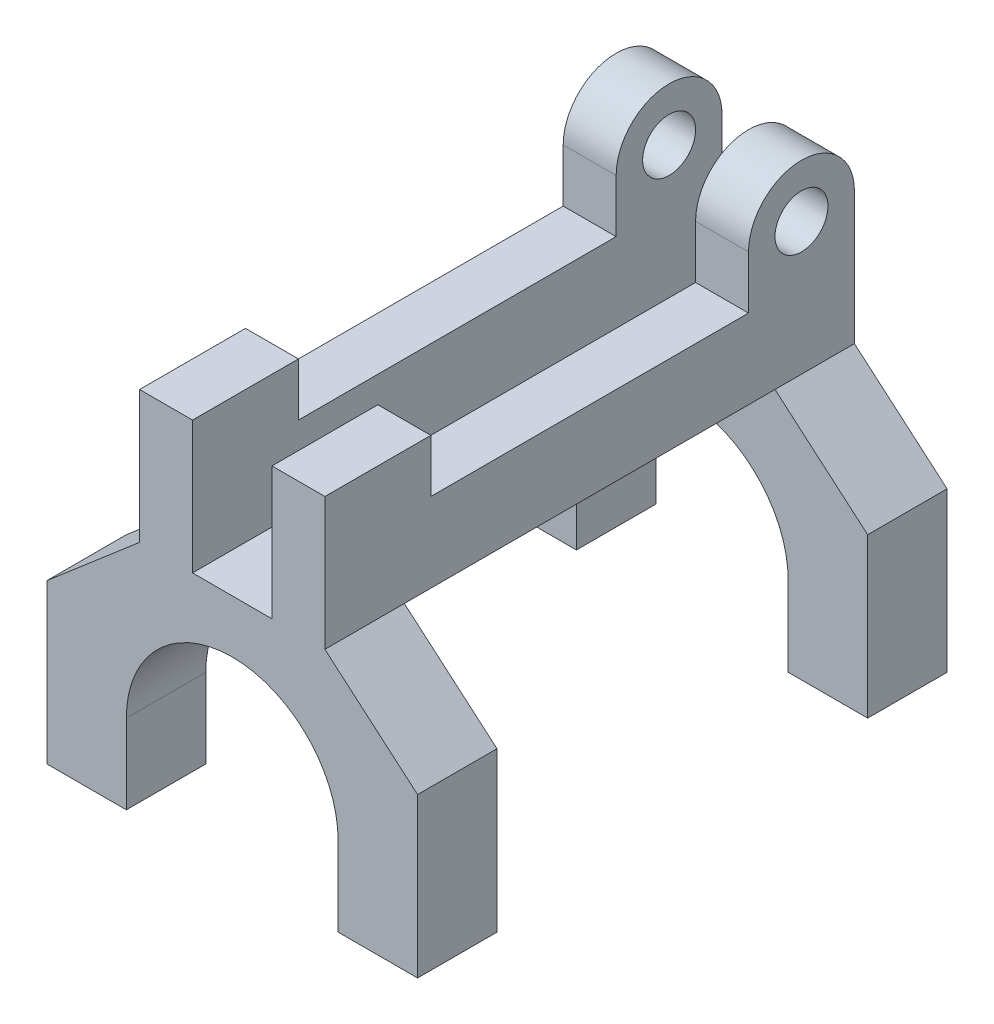
ISO-10303-21;
HEADER;
FILE_DESCRIPTION(('STEP AP214'),'2;1');
FILE_NAME('part.step','',(''),(''),'','','');
FILE_SCHEMA(('AUTOMOTIVE_DESIGN { 1 0 10303 214 1 1 1 1 }'));
ENDSEC;
DATA;
#1=APPLICATION_CONTEXT('core data for automotive mechanical design processes');
#2=APPLICATION_PROTOCOL_DEFINITION('international standard','automotive_design',2000,#1);
#3=PRODUCT_CONTEXT('',#1,'mechanical');
#4=PRODUCT('Part','Part','',(#3));
#5=PRODUCT_RELATED_PRODUCT_CATEGORY('part','',(#4));
#6=PRODUCT_DEFINITION_FORMATION('','',#4);
#7=PRODUCT_DEFINITION_CONTEXT('part definition',#1,'design');
#8=PRODUCT_DEFINITION('design','',#6,#7);
#9=PRODUCT_DEFINITION_SHAPE('','',#8);
#10=(LENGTH_UNIT() NAMED_UNIT(*) SI_UNIT(.MILLI.,.METRE.));
#11=(NAMED_UNIT(*) PLANE_ANGLE_UNIT() SI_UNIT($,.RADIAN.));
#12=(NAMED_UNIT(*) SI_UNIT($,.STERADIAN.) SOLID_ANGLE_UNIT());
#13=UNCERTAINTY_MEASURE_WITH_UNIT(LENGTH_MEASURE(1.E-05),#10,'distance_accuracy_value','');
#14=(GEOMETRIC_REPRESENTATION_CONTEXT(3) GLOBAL_UNCERTAINTY_ASSIGNED_CONTEXT((#13)) GLOBAL_UNIT_ASSIGNED_CONTEXT((#10,
#11,#12)) REPRESENTATION_CONTEXT('',''));
#15=CARTESIAN_POINT('',(0.,0.,0.));
#16=DIRECTION('',(0.,0.,1.));
#17=DIRECTION('',(1.,0.,0.));
#18=AXIS2_PLACEMENT_3D('',#15,#16,#17);
#19=CARTESIAN_POINT('',(0.,0.,127.));
#20=DIRECTION('',(0.,0.,-1.));
#21=DIRECTION('',(-1.,0.,0.));
#22=AXIS2_PLACEMENT_3D('',#19,#20,#21);
#23=CYLINDRICAL_SURFACE('',#22,25.4);
#24=CARTESIAN_POINT('',(0.,0.,19.05));
#25=DIRECTION('',(0.,0.,1.));
#26=DIRECTION('',(1.,0.,0.));
#27=AXIS2_PLACEMENT_3D('',#24,#25,#26);
#28=CIRCLE('',#27,25.4);
#29=CARTESIAN_POINT('',(-25.4,0.,19.05));
#30=VERTEX_POINT('',#29);
#31=CARTESIAN_POINT('',(25.4,0.,19.05));
#32=VERTEX_POINT('',#31);
#33=EDGE_CURVE('E606',#30,#32,#28,.F.);
#34=ORIENTED_EDGE('',*,*,#33,.F.);
#35=DIRECTION('',(0.,0.,-1.));
#36=VECTOR('',#35,1.);
#37=CARTESIAN_POINT('',(-25.4,0.,127.));
#38=LINE('',#37,#36);
#39=CARTESIAN_POINT('',(-25.4,0.,0.));
#40=VERTEX_POINT('',#39);
#41=EDGE_CURVE('E557',#30,#40,#38,.T.);
#42=ORIENTED_EDGE('',*,*,#41,.T.);
#43=CARTESIAN_POINT('',(0.,0.,0.));
#44=DIRECTION('',(0.,0.,-1.));
#45=DIRECTION('',(-1.,0.,0.));
#46=AXIS2_PLACEMENT_3D('',#43,#44,#45);
#47=CIRCLE('',#46,25.4);
#48=CARTESIAN_POINT('',(25.4,0.,0.));
#49=VERTEX_POINT('',#48);
#50=EDGE_CURVE('E505',#40,#49,#47,.T.);
#51=ORIENTED_EDGE('',*,*,#50,.T.);
#52=DIRECTION('',(0.,0.,-1.));
#53=VECTOR('',#52,1.);
#54=CARTESIAN_POINT('',(25.4,0.,127.));
#55=LINE('',#54,#53);
#56=EDGE_CURVE('E338',#32,#49,#55,.T.);
#57=ORIENTED_EDGE('',*,*,#56,.F.);
#58=EDGE_LOOP('',(#34,#42,#51,#57));
#59=FACE_BOUND('',#58,.T.);
#60=ADVANCED_FACE('F39',(#59),#23,.F.);
#61=CARTESIAN_POINT('',(25.4,0.,127.));
#62=DIRECTION('',(1.,0.,0.));
#63=DIRECTION('',(0.,1.,0.));
#64=AXIS2_PLACEMENT_3D('',#61,#62,#63);
#65=PLANE('',#64);
#66=DIRECTION('',(0.,-1.,0.));
#67=VECTOR('',#66,1.);
#68=CARTESIAN_POINT('',(25.4,0.,19.05));
#69=LINE('',#68,#67);
#70=CARTESIAN_POINT('',(25.4,-19.05,19.05));
#71=VERTEX_POINT('',#70);
#72=EDGE_CURVE('E620',#32,#71,#69,.T.);
#73=ORIENTED_EDGE('',*,*,#72,.F.);
#74=ORIENTED_EDGE('',*,*,#56,.T.);
#75=DIRECTION('',(0.,-1.,0.));
#76=VECTOR('',#75,1.);
#77=CARTESIAN_POINT('',(25.4,0.,0.));
#78=LINE('',#77,#76);
#79=CARTESIAN_POINT('',(25.4,-19.05,0.));
#80=VERTEX_POINT('',#79);
#81=EDGE_CURVE('E561',#49,#80,#78,.T.);
#82=ORIENTED_EDGE('',*,*,#81,.T.);
#83=DIRECTION('',(0.,0.,-1.));
#84=VECTOR('',#83,1.);
#85=CARTESIAN_POINT('',(25.4,-19.05,127.));
#86=LINE('',#85,#84);
#87=EDGE_CURVE('E333',#71,#80,#86,.T.);
#88=ORIENTED_EDGE('',*,*,#87,.F.);
#89=EDGE_LOOP('',(#73,#74,#82,#88));
#90=FACE_BOUND('',#89,.T.);
#91=ADVANCED_FACE('F619',(#90),#65,.F.);
#92=CARTESIAN_POINT('',(25.4,-19.05,127.));
#93=DIRECTION('',(0.,1.,0.));
#94=DIRECTION('',(0.,0.,1.));
#95=AXIS2_PLACEMENT_3D('',#92,#93,#94);
#96=PLANE('',#95);
#97=DIRECTION('',(-1.,0.,0.));
#98=VECTOR('',#97,1.);
#99=CARTESIAN_POINT('',(93.2180000000001,-19.05,19.05));
#100=LINE('',#99,#98);
#101=CARTESIAN_POINT('',(44.45,-19.05,19.05));
#102=VERTEX_POINT('',#101);
#103=EDGE_CURVE('E284',#102,#71,#100,.T.);
#104=ORIENTED_EDGE('',*,*,#103,.T.);
#105=ORIENTED_EDGE('',*,*,#87,.T.);
#106=DIRECTION('',(1.,0.,0.));
#107=VECTOR('',#106,1.);
#108=CARTESIAN_POINT('',(25.4,-19.05,0.));
#109=LINE('',#108,#107);
#110=CARTESIAN_POINT('',(44.45,-19.05,0.));
#111=VERTEX_POINT('',#110);
#112=EDGE_CURVE('E565',#80,#111,#109,.T.);
#113=ORIENTED_EDGE('',*,*,#112,.T.);
#114=DIRECTION('',(0.,0.,-1.));
#115=VECTOR('',#114,1.);
#116=CARTESIAN_POINT('',(44.45,-19.05,127.));
#117=LINE('',#116,#115);
#118=EDGE_CURVE('E328',#102,#111,#117,.T.);
#119=ORIENTED_EDGE('',*,*,#118,.F.);
#120=EDGE_LOOP('',(#104,#105,#113,#119));
#121=FACE_BOUND('',#120,.T.);
#122=ADVANCED_FACE('F684',(#121),#96,.F.);
#123=CARTESIAN_POINT('',(44.45,-19.05,127.));
#124=DIRECTION('',(-1.,0.,0.));
#125=DIRECTION('',(0.,0.,1.));
#126=AXIS2_PLACEMENT_3D('',#123,#124,#125);
#127=PLANE('',#126);
#128=DIRECTION('',(0.,1.,0.));
#129=VECTOR('',#128,1.);
#130=CARTESIAN_POINT('',(44.45,-19.05,19.05));
#131=LINE('',#130,#129);
#132=CARTESIAN_POINT('',(44.45,19.05,19.05));
#133=VERTEX_POINT('',#132);
#134=EDGE_CURVE('E768',#102,#133,#131,.T.);
#135=ORIENTED_EDGE('',*,*,#134,.F.);
#136=ORIENTED_EDGE('',*,*,#118,.T.);
#137=DIRECTION('',(0.,1.,0.));
#138=VECTOR('',#137,1.);
#139=CARTESIAN_POINT('',(44.45,-19.05,0.));
#140=LINE('',#139,#138);
#141=CARTESIAN_POINT('',(44.45,19.05,0.));
#142=VERTEX_POINT('',#141);
#143=EDGE_CURVE('E569',#111,#142,#140,.T.);
#144=ORIENTED_EDGE('',*,*,#143,.T.);
#145=DIRECTION('',(0.,0.,-1.));
#146=VECTOR('',#145,1.);
#147=CARTESIAN_POINT('',(44.45,19.05,127.));
#148=LINE('',#147,#146);
#149=EDGE_CURVE('E323',#133,#142,#148,.T.);
#150=ORIENTED_EDGE('',*,*,#149,.F.);
#151=EDGE_LOOP('',(#135,#136,#144,#150));
#152=FACE_BOUND('',#151,.T.);
#153=ADVANCED_FACE('F766',(#152),#127,.F.);
#154=CARTESIAN_POINT('',(44.45,19.05,127.));
#155=DIRECTION('',(-0.650791373455969,-0.759256602365297,0.));
#156=DIRECTION('',(0.759256602365297,-0.650791373455969,0.));
#157=AXIS2_PLACEMENT_3D('',#154,#155,#156);
#158=PLANE('',#157);
#159=DIRECTION('',(-0.759256602365297,0.650791373455969,0.));
#160=VECTOR('',#159,1.);
#161=CARTESIAN_POINT('',(44.45,19.05,19.05));
#162=LINE('',#161,#160);
#163=CARTESIAN_POINT('',(22.225,38.1,19.05));
#164=VERTEX_POINT('',#163);
#165=EDGE_CURVE('E814',#133,#164,#162,.T.);
#166=ORIENTED_EDGE('',*,*,#165,.F.);
#167=ORIENTED_EDGE('',*,*,#149,.T.);
#168=DIRECTION('',(-0.759256602365297,0.650791373455968,0.));
#169=VECTOR('',#168,1.);
#170=CARTESIAN_POINT('',(44.45,19.05,0.));
#171=LINE('',#170,#169);
#172=CARTESIAN_POINT('',(22.225,38.1,0.));
#173=VERTEX_POINT('',#172);
#174=EDGE_CURVE('E573',#142,#173,#171,.T.);
#175=ORIENTED_EDGE('',*,*,#174,.T.);
#176=DIRECTION('',(0.,0.,-1.));
#177=VECTOR('',#176,1.);
#178=CARTESIAN_POINT('',(22.225,38.1,127.));
#179=LINE('',#178,#177);
#180=EDGE_CURVE('E318',#164,#173,#179,.T.);
#181=ORIENTED_EDGE('',*,*,#180,.F.);
#182=EDGE_LOOP('',(#166,#167,#175,#181));
#183=FACE_BOUND('',#182,.T.);
#184=ADVANCED_FACE('F762',(#183),#158,.F.);
#185=CARTESIAN_POINT('',(-44.45,19.05,127.));
#186=DIRECTION('',(0.650791373455969,-0.759256602365297,0.));
#187=DIRECTION('',(0.759256602365297,0.650791373455969,0.));
#188=AXIS2_PLACEMENT_3D('',#185,#186,#187);
#189=PLANE('',#188);
#190=DIRECTION('',(-0.759256602365297,-0.650791373455969,0.));
#191=VECTOR('',#190,1.);
#192=CARTESIAN_POINT('',(-44.45,19.05,19.05));
#193=LINE('',#192,#191);
#194=CARTESIAN_POINT('',(-22.225,38.1,19.05));
#195=VERTEX_POINT('',#194);
#196=CARTESIAN_POINT('',(-44.45,19.05,19.05));
#197=VERTEX_POINT('',#196);
#198=EDGE_CURVE('E634',#195,#197,#193,.T.);
#199=ORIENTED_EDGE('',*,*,#198,.F.);
#200=DIRECTION('',(0.,0.,-1.));
#201=VECTOR('',#200,1.);
#202=CARTESIAN_POINT('',(-22.225,38.1,127.));
#203=LINE('',#202,#201);
#204=CARTESIAN_POINT('',(-22.225,38.1,0.));
#205=VERTEX_POINT('',#204);
#206=EDGE_CURVE('E313',#195,#205,#203,.T.);
#207=ORIENTED_EDGE('',*,*,#206,.T.);
#208=DIRECTION('',(-0.759256602365297,-0.650791373455969,0.));
#209=VECTOR('',#208,1.);
#210=CARTESIAN_POINT('',(-44.45,19.05,0.));
#211=LINE('',#210,#209);
#212=CARTESIAN_POINT('',(-44.45,19.05,0.));
#213=VERTEX_POINT('',#212);
#214=EDGE_CURVE('E577',#205,#213,#211,.T.);
#215=ORIENTED_EDGE('',*,*,#214,.T.);
#216=DIRECTION('',(0.,0.,-1.));
#217=VECTOR('',#216,1.);
#218=CARTESIAN_POINT('',(-44.45,19.05,127.));
#219=LINE('',#218,#217);
#220=EDGE_CURVE('E302',#197,#213,#219,.T.);
#221=ORIENTED_EDGE('',*,*,#220,.F.);
#222=EDGE_LOOP('',(#199,#207,#215,#221));
#223=FACE_BOUND('',#222,.T.);
#224=ADVANCED_FACE('F631',(#223),#189,.F.);
#225=CARTESIAN_POINT('',(-44.45,-19.05,127.));
#226=DIRECTION('',(1.,0.,0.));
#227=DIRECTION('',(0.,1.,0.));
#228=AXIS2_PLACEMENT_3D('',#225,#226,#227);
#229=PLANE('',#228);
#230=DIRECTION('',(0.,1.,0.));
#231=VECTOR('',#230,1.);
#232=CARTESIAN_POINT('',(-44.45,-19.05,19.05));
#233=LINE('',#232,#231);
#234=CARTESIAN_POINT('',(-44.45,-19.05,19.05));
#235=VERTEX_POINT('',#234);
#236=EDGE_CURVE('E297',#235,#197,#233,.T.);
#237=ORIENTED_EDGE('',*,*,#236,.T.);
#238=ORIENTED_EDGE('',*,*,#220,.T.);
#239=DIRECTION('',(0.,-1.,0.));
#240=VECTOR('',#239,1.);
#241=CARTESIAN_POINT('',(-44.45,-19.05,0.));
#242=LINE('',#241,#240);
#243=CARTESIAN_POINT('',(-44.45,-19.05,0.));
#244=VERTEX_POINT('',#243);
#245=EDGE_CURVE('E581',#213,#244,#242,.T.);
#246=ORIENTED_EDGE('',*,*,#245,.T.);
#247=DIRECTION('',(0.,0.,-1.));
#248=VECTOR('',#247,1.);
#249=CARTESIAN_POINT('',(-44.45,-19.05,127.));
#250=LINE('',#249,#248);
#251=EDGE_CURVE('E303',#235,#244,#250,.T.);
#252=ORIENTED_EDGE('',*,*,#251,.F.);
#253=EDGE_LOOP('',(#237,#238,#246,#252));
#254=FACE_BOUND('',#253,.T.);
#255=ADVANCED_FACE('F861',(#254),#229,.F.);
#256=CARTESIAN_POINT('',(-25.4,-19.05,127.));
#257=DIRECTION('',(0.,1.,0.));
#258=DIRECTION('',(-1.,0.,0.));
#259=AXIS2_PLACEMENT_3D('',#256,#257,#258);
#260=PLANE('',#259);
#261=CARTESIAN_POINT('',(-25.4,-19.05,19.05));
#262=VERTEX_POINT('',#261);
#263=EDGE_CURVE('E296',#262,#235,#100,.T.);
#264=ORIENTED_EDGE('',*,*,#263,.T.);
#265=ORIENTED_EDGE('',*,*,#251,.T.);
#266=DIRECTION('',(1.,0.,0.));
#267=VECTOR('',#266,1.);
#268=CARTESIAN_POINT('',(-25.4,-19.05,0.));
#269=LINE('',#268,#267);
#270=CARTESIAN_POINT('',(-25.4,-19.05,0.));
#271=VERTEX_POINT('',#270);
#272=EDGE_CURVE('E585',#244,#271,#269,.T.);
#273=ORIENTED_EDGE('',*,*,#272,.T.);
#274=DIRECTION('',(0.,0.,-1.));
#275=VECTOR('',#274,1.);
#276=CARTESIAN_POINT('',(-25.4,-19.05,127.));
#277=LINE('',#276,#275);
#278=EDGE_CURVE('E594',#262,#271,#277,.T.);
#279=ORIENTED_EDGE('',*,*,#278,.F.);
#280=EDGE_LOOP('',(#264,#265,#273,#279));
#281=FACE_BOUND('',#280,.T.);
#282=ADVANCED_FACE('F853',(#281),#260,.F.);
#283=CARTESIAN_POINT('',(-25.4,0.,127.));
#284=DIRECTION('',(-1.,0.,0.));
#285=DIRECTION('',(0.,-1.,0.));
#286=AXIS2_PLACEMENT_3D('',#283,#284,#285);
#287=PLANE('',#286);
#288=DIRECTION('',(0.,1.,0.));
#289=VECTOR('',#288,1.);
#290=CARTESIAN_POINT('',(-25.4,0.,19.05));
#291=LINE('',#290,#289);
#292=EDGE_CURVE('E805',#262,#30,#291,.T.);
#293=ORIENTED_EDGE('',*,*,#292,.F.);
#294=ORIENTED_EDGE('',*,*,#278,.T.);
#295=DIRECTION('',(0.,1.,0.));
#296=VECTOR('',#295,1.);
#297=CARTESIAN_POINT('',(-25.4,0.,0.));
#298=LINE('',#297,#296);
#299=EDGE_CURVE('E534',#271,#40,#298,.T.);
#300=ORIENTED_EDGE('',*,*,#299,.T.);
#301=ORIENTED_EDGE('',*,*,#41,.F.);
#302=EDGE_LOOP('',(#293,#294,#300,#301));
#303=FACE_BOUND('',#302,.T.);
#304=ADVANCED_FACE('F610',(#303),#287,.F.);
#305=CARTESIAN_POINT('',(-9.525,38.1,-10.668));
#306=DIRECTION('',(0.,-1.,0.));
#307=DIRECTION('',(0.,0.,-1.));
#308=AXIS2_PLACEMENT_3D('',#305,#306,#307);
#309=PLANE('',#308);
#310=DIRECTION('',(-1.,0.,0.));
#311=VECTOR('',#310,1.);
#312=CARTESIAN_POINT('',(-9.525,38.1,19.05));
#313=LINE('',#312,#311);
#314=CARTESIAN_POINT('',(9.52499999999999,38.1,19.05));
#315=VERTEX_POINT('',#314);
#316=CARTESIAN_POINT('',(-9.52499999999999,38.1,19.05));
#317=VERTEX_POINT('',#316);
#318=EDGE_CURVE('E11',#315,#317,#313,.T.);
#319=ORIENTED_EDGE('',*,*,#318,.F.);
#320=DIRECTION('',(0.,0.,1.));
#321=VECTOR('',#320,1.);
#322=CARTESIAN_POINT('',(9.525,38.1,-10.668));
#323=LINE('',#322,#321);
#324=CARTESIAN_POINT('',(9.525,38.1,0.));
#325=VERTEX_POINT('',#324);
#326=EDGE_CURVE('E349',#325,#315,#323,.T.);
#327=ORIENTED_EDGE('',*,*,#326,.F.);
#328=DIRECTION('',(-1.,0.,0.));
#329=VECTOR('',#328,1.);
#330=CARTESIAN_POINT('',(0.,38.1,0.));
#331=LINE('',#330,#329);
#332=CARTESIAN_POINT('',(-9.525,38.1,0.));
#333=VERTEX_POINT('',#332);
#334=EDGE_CURVE('E343',#325,#333,#331,.T.);
#335=ORIENTED_EDGE('',*,*,#334,.T.);
#336=DIRECTION('',(0.,0.,1.));
#337=VECTOR('',#336,1.);
#338=CARTESIAN_POINT('',(-9.525,38.1,-10.668));
#339=LINE('',#338,#337);
#340=EDGE_CURVE('E383',#333,#317,#339,.T.);
#341=ORIENTED_EDGE('',*,*,#340,.T.);
#342=EDGE_LOOP('',(#319,#327,#335,#341));
#343=FACE_BOUND('',#342,.T.);
#344=ADVANCED_FACE('F404',(#343),#309,.F.);
#345=CARTESIAN_POINT('',(-22.225,69.85,127.));
#346=DIRECTION('',(0.,1.,0.));
#347=DIRECTION('',(-1.,0.,0.));
#348=AXIS2_PLACEMENT_3D('',#345,#346,#347);
#349=PLANE('',#348);
#350=DIRECTION('',(0.,0.,-1.));
#351=VECTOR('',#350,1.);
#352=CARTESIAN_POINT('',(9.52500000000001,69.85,127.));
#353=LINE('',#352,#351);
#354=CARTESIAN_POINT('',(9.525,69.85,127.));
#355=VERTEX_POINT('',#354);
#356=CARTESIAN_POINT('',(9.52500000000001,69.85,101.6));
#357=VERTEX_POINT('',#356);
#358=EDGE_CURVE('E432',#355,#357,#353,.T.);
#359=ORIENTED_EDGE('',*,*,#358,.F.);
#360=DIRECTION('',(1.,0.,0.));
#361=VECTOR('',#360,1.);
#362=CARTESIAN_POINT('',(-22.225,69.85,127.));
#363=LINE('',#362,#361);
#364=CARTESIAN_POINT('',(22.225,69.85,127.));
#365=VERTEX_POINT('',#364);
#366=EDGE_CURVE('E506',#355,#365,#363,.T.);
#367=ORIENTED_EDGE('',*,*,#366,.T.);
#368=DIRECTION('',(0.,0.,1.));
#369=VECTOR('',#368,1.);
#370=CARTESIAN_POINT('',(22.225,69.85,127.));
#371=LINE('',#370,#369);
#372=CARTESIAN_POINT('',(22.225,69.85,101.6));
#373=VERTEX_POINT('',#372);
#374=EDGE_CURVE('E494',#373,#365,#371,.T.);
#375=ORIENTED_EDGE('',*,*,#374,.F.);
#376=DIRECTION('',(1.,0.,0.));
#377=VECTOR('',#376,1.);
#378=CARTESIAN_POINT('',(-22.225,69.85,101.6));
#379=LINE('',#378,#377);
#380=EDGE_CURVE('E511',#357,#373,#379,.T.);
#381=ORIENTED_EDGE('',*,*,#380,.F.);
#382=EDGE_LOOP('',(#359,#367,#375,#381));
#383=FACE_BOUND('',#382,.T.);
#384=ADVANCED_FACE('F723',(#383),#349,.T.);
#385=CARTESIAN_POINT('',(-22.225,69.85,101.6));
#386=DIRECTION('',(0.,0.,-1.));
#387=DIRECTION('',(0.,1.,0.));
#388=AXIS2_PLACEMENT_3D('',#385,#386,#387);
#389=PLANE('',#388);
#390=DIRECTION('',(0.,-1.,0.));
#391=VECTOR('',#390,1.);
#392=CARTESIAN_POINT('',(9.52500000000001,69.85,101.6));
#393=LINE('',#392,#391);
#394=CARTESIAN_POINT('',(9.525,57.15,101.6));
#395=VERTEX_POINT('',#394);
#396=EDGE_CURVE('E429',#357,#395,#393,.T.);
#397=ORIENTED_EDGE('',*,*,#396,.F.);
#398=ORIENTED_EDGE('',*,*,#380,.T.);
#399=DIRECTION('',(0.,1.,0.));
#400=VECTOR('',#399,1.);
#401=CARTESIAN_POINT('',(22.225,69.85,101.6));
#402=LINE('',#401,#400);
#403=CARTESIAN_POINT('',(22.225,57.15,101.6));
#404=VERTEX_POINT('',#403);
#405=EDGE_CURVE('E490',#404,#373,#402,.T.);
#406=ORIENTED_EDGE('',*,*,#405,.F.);
#407=DIRECTION('',(1.,0.,0.));
#408=VECTOR('',#407,1.);
#409=CARTESIAN_POINT('',(-22.225,57.15,101.6));
#410=LINE('',#409,#408);
#411=EDGE_CURVE('E516',#395,#404,#410,.T.);
#412=ORIENTED_EDGE('',*,*,#411,.F.);
#413=EDGE_LOOP('',(#397,#398,#406,#412));
#414=FACE_BOUND('',#413,.T.);
#415=ADVANCED_FACE('F725',(#414),#389,.T.);
#416=CARTESIAN_POINT('',(-22.225,57.15,101.6));
#417=DIRECTION('',(0.,1.,0.));
#418=DIRECTION('',(-1.,0.,0.));
#419=AXIS2_PLACEMENT_3D('',#416,#417,#418);
#420=PLANE('',#419);
#421=DIRECTION('',(0.,0.,-1.));
#422=VECTOR('',#421,1.);
#423=CARTESIAN_POINT('',(9.525,57.15,101.6));
#424=LINE('',#423,#422);
#425=CARTESIAN_POINT('',(9.525,57.15,25.4));
#426=VERTEX_POINT('',#425);
#427=EDGE_CURVE('E426',#395,#426,#424,.T.);
#428=ORIENTED_EDGE('',*,*,#427,.F.);
#429=ORIENTED_EDGE('',*,*,#411,.T.);
#430=DIRECTION('',(0.,0.,1.));
#431=VECTOR('',#430,1.);
#432=CARTESIAN_POINT('',(22.225,57.15,101.6));
#433=LINE('',#432,#431);
#434=CARTESIAN_POINT('',(22.225,57.15,25.4));
#435=VERTEX_POINT('',#434);
#436=EDGE_CURVE('E486',#435,#404,#433,.T.);
#437=ORIENTED_EDGE('',*,*,#436,.F.);
#438=DIRECTION('',(1.,0.,0.));
#439=VECTOR('',#438,1.);
#440=CARTESIAN_POINT('',(-22.225,57.15,25.4));
#441=LINE('',#440,#439);
#442=EDGE_CURVE('E521',#426,#435,#441,.T.);
#443=ORIENTED_EDGE('',*,*,#442,.F.);
#444=EDGE_LOOP('',(#428,#429,#437,#443));
#445=FACE_BOUND('',#444,.T.);
#446=ADVANCED_FACE('F677',(#445),#420,.T.);
#447=CARTESIAN_POINT('',(-22.225,57.15,25.4));
#448=DIRECTION('',(0.,0.,1.));
#449=DIRECTION('',(0.,-1.,0.));
#450=AXIS2_PLACEMENT_3D('',#447,#448,#449);
#451=PLANE('',#450);
#452=DIRECTION('',(0.,1.,0.));
#453=VECTOR('',#452,1.);
#454=CARTESIAN_POINT('',(9.525,57.15,25.4));
#455=LINE('',#454,#453);
#456=CARTESIAN_POINT('',(9.52500000000001,69.85,25.4));
#457=VERTEX_POINT('',#456);
#458=EDGE_CURVE('E423',#426,#457,#455,.T.);
#459=ORIENTED_EDGE('',*,*,#458,.F.);
#460=ORIENTED_EDGE('',*,*,#442,.T.);
#461=DIRECTION('',(0.,-1.,0.));
#462=VECTOR('',#461,1.);
#463=CARTESIAN_POINT('',(22.225,57.15,25.4));
#464=LINE('',#463,#462);
#465=CARTESIAN_POINT('',(22.225,69.85,25.4));
#466=VERTEX_POINT('',#465);
#467=EDGE_CURVE('E482',#466,#435,#464,.T.);
#468=ORIENTED_EDGE('',*,*,#467,.F.);
#469=DIRECTION('',(1.,0.,0.));
#470=VECTOR('',#469,1.);
#471=CARTESIAN_POINT('',(-22.225,69.85,25.4));
#472=LINE('',#471,#470);
#473=EDGE_CURVE('E526',#457,#466,#472,.T.);
#474=ORIENTED_EDGE('',*,*,#473,.F.);
#475=EDGE_LOOP('',(#459,#460,#468,#474));
#476=FACE_BOUND('',#475,.T.);
#477=ADVANCED_FACE('F669',(#476),#451,.T.);
#478=CARTESIAN_POINT('',(-22.225,69.85,12.7));
#479=DIRECTION('',(1.,0.,0.));
#480=DIRECTION('',(0.,1.,0.));
#481=AXIS2_PLACEMENT_3D('',#478,#479,#480);
#482=CYLINDRICAL_SURFACE('',#481,12.7);
#483=CARTESIAN_POINT('',(9.52500000000001,69.85,12.7));
#484=DIRECTION('',(1.,0.,0.));
#485=DIRECTION('',(0.,1.,0.));
#486=AXIS2_PLACEMENT_3D('',#483,#484,#485);
#487=CIRCLE('',#486,12.7);
#488=CARTESIAN_POINT('',(9.52500000000001,69.85,0.));
#489=VERTEX_POINT('',#488);
#490=EDGE_CURVE('E354',#457,#489,#487,.F.);
#491=ORIENTED_EDGE('',*,*,#490,.F.);
#492=ORIENTED_EDGE('',*,*,#473,.T.);
#493=CARTESIAN_POINT('',(22.225,69.85,12.7));
#494=DIRECTION('',(1.,0.,0.));
#495=DIRECTION('',(0.,-1.,0.));
#496=AXIS2_PLACEMENT_3D('',#493,#494,#495);
#497=CIRCLE('',#496,12.7);
#498=CARTESIAN_POINT('',(22.225,69.85,0.));
#499=VERTEX_POINT('',#498);
#500=EDGE_CURVE('E478',#499,#466,#497,.T.);
#501=ORIENTED_EDGE('',*,*,#500,.F.);
#502=DIRECTION('',(1.,0.,0.));
#503=VECTOR('',#502,1.);
#504=CARTESIAN_POINT('',(-22.225,69.85,0.));
#505=LINE('',#504,#503);
#506=EDGE_CURVE('E474',#489,#499,#505,.T.);
#507=ORIENTED_EDGE('',*,*,#506,.F.);
#508=EDGE_LOOP('',(#491,#492,#501,#507));
#509=FACE_BOUND('',#508,.T.);
#510=ADVANCED_FACE('F675',(#509),#482,.T.);
#511=CARTESIAN_POINT('',(-22.225,69.85,12.7));
#512=DIRECTION('',(1.,0.,0.));
#513=DIRECTION('',(0.,1.,0.));
#514=AXIS2_PLACEMENT_3D('',#511,#512,#513);
#515=CYLINDRICAL_SURFACE('',#514,6.35);
#516=CARTESIAN_POINT('',(9.52500000000001,69.85,12.7));
#517=DIRECTION('',(1.,0.,0.));
#518=DIRECTION('',(0.,1.,0.));
#519=AXIS2_PLACEMENT_3D('',#516,#517,#518);
#520=CIRCLE('',#519,6.35);
#521=CARTESIAN_POINT('',(9.52500000000001,76.2,12.7));
#522=VERTEX_POINT('',#521);
#523=EDGE_CURVE('E350',#522,#522,#520,.F.);
#524=ORIENTED_EDGE('',*,*,#523,.T.);
#525=EDGE_LOOP('',(#524));
#526=FACE_BOUND('',#525,.T.);
#527=CARTESIAN_POINT('',(22.225,69.85,12.7));
#528=DIRECTION('',(1.,0.,0.));
#529=DIRECTION('',(0.,1.,0.));
#530=AXIS2_PLACEMENT_3D('',#527,#528,#529);
#531=CIRCLE('',#530,6.35);
#532=CARTESIAN_POINT('',(22.225,76.2,12.7));
#533=VERTEX_POINT('',#532);
#534=EDGE_CURVE('E437',#533,#533,#531,.T.);
#535=ORIENTED_EDGE('',*,*,#534,.T.);
#536=EDGE_LOOP('',(#535));
#537=FACE_BOUND('',#536,.T.);
#538=ADVANCED_FACE('F687',(#526,#537),#515,.F.);
#539=CARTESIAN_POINT('',(-25.4,0.,127.));
#540=VERTEX_POINT('',#539);
#541=CARTESIAN_POINT('',(-25.4,0.,107.95));
#542=VERTEX_POINT('',#541);
#543=EDGE_CURVE('E591',#540,#542,#38,.T.);
#544=ORIENTED_EDGE('',*,*,#543,.T.);
#545=CARTESIAN_POINT('',(0.,0.,107.95));
#546=DIRECTION('',(0.,0.,1.));
#547=DIRECTION('',(1.,0.,0.));
#548=AXIS2_PLACEMENT_3D('',#545,#546,#547);
#549=CIRCLE('',#548,25.4);
#550=CARTESIAN_POINT('',(25.4,0.,107.95));
#551=VERTEX_POINT('',#550);
#552=EDGE_CURVE('E787',#542,#551,#549,.F.);
#553=ORIENTED_EDGE('',*,*,#552,.T.);
#554=CARTESIAN_POINT('',(25.4,0.,127.));
#555=VERTEX_POINT('',#554);
#556=EDGE_CURVE('E339',#555,#551,#55,.T.);
#557=ORIENTED_EDGE('',*,*,#556,.F.);
#558=CARTESIAN_POINT('',(0.,0.,127.));
#559=DIRECTION('',(0.,0.,-1.));
#560=DIRECTION('',(-1.,0.,0.));
#561=AXIS2_PLACEMENT_3D('',#558,#559,#560);
#562=CIRCLE('',#561,25.4);
#563=EDGE_CURVE('E529',#540,#555,#562,.T.);
#564=ORIENTED_EDGE('',*,*,#563,.F.);
#565=EDGE_LOOP('',(#544,#553,#557,#564));
#566=FACE_BOUND('',#565,.T.);
#567=ADVANCED_FACE('F41',(#566),#23,.F.);
#568=ORIENTED_EDGE('',*,*,#556,.T.);
#569=DIRECTION('',(0.,-1.,0.));
#570=VECTOR('',#569,1.);
#571=CARTESIAN_POINT('',(25.4,0.,107.95));
#572=LINE('',#571,#570);
#573=CARTESIAN_POINT('',(25.4,-19.05,107.95));
#574=VERTEX_POINT('',#573);
#575=EDGE_CURVE('E790',#551,#574,#572,.T.);
#576=ORIENTED_EDGE('',*,*,#575,.T.);
#577=CARTESIAN_POINT('',(25.4,-19.05,127.));
#578=VERTEX_POINT('',#577);
#579=EDGE_CURVE('E334',#578,#574,#86,.T.);
#580=ORIENTED_EDGE('',*,*,#579,.F.);
#581=DIRECTION('',(0.,-1.,0.));
#582=VECTOR('',#581,1.);
#583=CARTESIAN_POINT('',(25.4,0.,127.));
#584=LINE('',#583,#582);
#585=EDGE_CURVE('E533',#555,#578,#584,.T.);
#586=ORIENTED_EDGE('',*,*,#585,.F.);
#587=EDGE_LOOP('',(#568,#576,#580,#586));
#588=FACE_BOUND('',#587,.T.);
#589=ADVANCED_FACE('F685',(#588),#65,.F.);
#590=ORIENTED_EDGE('',*,*,#579,.T.);
#591=DIRECTION('',(-1.,0.,0.));
#592=VECTOR('',#591,1.);
#593=CARTESIAN_POINT('',(93.2180000000001,-19.05,107.95));
#594=LINE('',#593,#592);
#595=CARTESIAN_POINT('',(44.45,-19.05,107.95));
#596=VERTEX_POINT('',#595);
#597=EDGE_CURVE('E283',#596,#574,#594,.T.);
#598=ORIENTED_EDGE('',*,*,#597,.F.);
#599=CARTESIAN_POINT('',(44.45,-19.05,127.));
#600=VERTEX_POINT('',#599);
#601=EDGE_CURVE('E329',#600,#596,#117,.T.);
#602=ORIENTED_EDGE('',*,*,#601,.F.);
#603=DIRECTION('',(1.,0.,0.));
#604=VECTOR('',#603,1.);
#605=CARTESIAN_POINT('',(25.4,-19.05,127.));
#606=LINE('',#605,#604);
#607=EDGE_CURVE('E537',#578,#600,#606,.T.);
#608=ORIENTED_EDGE('',*,*,#607,.F.);
#609=EDGE_LOOP('',(#590,#598,#602,#608));
#610=FACE_BOUND('',#609,.T.);
#611=ADVANCED_FACE('F692',(#610),#96,.F.);
#612=ORIENTED_EDGE('',*,*,#601,.T.);
#613=DIRECTION('',(0.,1.,0.));
#614=VECTOR('',#613,1.);
#615=CARTESIAN_POINT('',(44.45,-19.05,107.95));
#616=LINE('',#615,#614);
#617=CARTESIAN_POINT('',(44.45,19.05,107.95));
#618=VERTEX_POINT('',#617);
#619=EDGE_CURVE('E801',#596,#618,#616,.T.);
#620=ORIENTED_EDGE('',*,*,#619,.T.);
#621=CARTESIAN_POINT('',(44.45,19.05,127.));
#622=VERTEX_POINT('',#621);
#623=EDGE_CURVE('E324',#622,#618,#148,.T.);
#624=ORIENTED_EDGE('',*,*,#623,.F.);
#625=DIRECTION('',(0.,1.,0.));
#626=VECTOR('',#625,1.);
#627=CARTESIAN_POINT('',(44.45,-19.05,127.));
#628=LINE('',#627,#626);
#629=EDGE_CURVE('E540',#600,#622,#628,.T.);
#630=ORIENTED_EDGE('',*,*,#629,.F.);
#631=EDGE_LOOP('',(#612,#620,#624,#630));
#632=FACE_BOUND('',#631,.T.);
#633=ADVANCED_FACE('F877',(#632),#127,.F.);
#634=ORIENTED_EDGE('',*,*,#623,.T.);
#635=DIRECTION('',(-0.759256602365297,0.650791373455969,0.));
#636=VECTOR('',#635,1.);
#637=CARTESIAN_POINT('',(44.45,19.05,107.95));
#638=LINE('',#637,#636);
#639=CARTESIAN_POINT('',(22.225,38.1,107.95));
#640=VERTEX_POINT('',#639);
#641=EDGE_CURVE('E797',#618,#640,#638,.T.);
#642=ORIENTED_EDGE('',*,*,#641,.T.);
#643=CARTESIAN_POINT('',(22.225,38.1,127.));
#644=VERTEX_POINT('',#643);
#645=EDGE_CURVE('E319',#644,#640,#179,.T.);
#646=ORIENTED_EDGE('',*,*,#645,.F.);
#647=DIRECTION('',(-0.759256602365297,0.650791373455968,0.));
#648=VECTOR('',#647,1.);
#649=CARTESIAN_POINT('',(44.45,19.05,127.));
#650=LINE('',#649,#648);
#651=EDGE_CURVE('E543',#622,#644,#650,.T.);
#652=ORIENTED_EDGE('',*,*,#651,.F.);
#653=EDGE_LOOP('',(#634,#642,#646,#652));
#654=FACE_BOUND('',#653,.T.);
#655=ADVANCED_FACE('F873',(#654),#158,.F.);
#656=CARTESIAN_POINT('',(-22.225,38.1,127.));
#657=VERTEX_POINT('',#656);
#658=CARTESIAN_POINT('',(-22.225,38.1,107.95));
#659=VERTEX_POINT('',#658);
#660=EDGE_CURVE('E314',#657,#659,#203,.T.);
#661=ORIENTED_EDGE('',*,*,#660,.T.);
#662=DIRECTION('',(-0.759256602365297,-0.650791373455969,0.));
#663=VECTOR('',#662,1.);
#664=CARTESIAN_POINT('',(-44.45,19.05,107.95));
#665=LINE('',#664,#663);
#666=CARTESIAN_POINT('',(-44.45,19.05,107.95));
#667=VERTEX_POINT('',#666);
#668=EDGE_CURVE('E794',#659,#667,#665,.T.);
#669=ORIENTED_EDGE('',*,*,#668,.T.);
#670=CARTESIAN_POINT('',(-44.45,19.05,127.));
#671=VERTEX_POINT('',#670);
#672=EDGE_CURVE('E294',#671,#667,#219,.T.);
#673=ORIENTED_EDGE('',*,*,#672,.F.);
#674=DIRECTION('',(-0.759256602365297,-0.650791373455969,0.));
#675=VECTOR('',#674,1.);
#676=CARTESIAN_POINT('',(-44.45,19.05,127.));
#677=LINE('',#676,#675);
#678=EDGE_CURVE('E546',#657,#671,#677,.T.);
#679=ORIENTED_EDGE('',*,*,#678,.F.);
#680=EDGE_LOOP('',(#661,#669,#673,#679));
#681=FACE_BOUND('',#680,.T.);
#682=ADVANCED_FACE('F870',(#681),#189,.F.);
#683=ORIENTED_EDGE('',*,*,#672,.T.);
#684=DIRECTION('',(0.,1.,0.));
#685=VECTOR('',#684,1.);
#686=CARTESIAN_POINT('',(-44.45,-19.05,107.95));
#687=LINE('',#686,#685);
#688=CARTESIAN_POINT('',(-44.45,-19.05,107.95));
#689=VERTEX_POINT('',#688);
#690=EDGE_CURVE('E274',#689,#667,#687,.T.);
#691=ORIENTED_EDGE('',*,*,#690,.F.);
#692=CARTESIAN_POINT('',(-44.45,-19.05,127.));
#693=VERTEX_POINT('',#692);
#694=EDGE_CURVE('E291',#693,#689,#250,.T.);
#695=ORIENTED_EDGE('',*,*,#694,.F.);
#696=DIRECTION('',(0.,-1.,0.));
#697=VECTOR('',#696,1.);
#698=CARTESIAN_POINT('',(-44.45,-19.05,127.));
#699=LINE('',#698,#697);
#700=EDGE_CURVE('E549',#671,#693,#699,.T.);
#701=ORIENTED_EDGE('',*,*,#700,.F.);
#702=EDGE_LOOP('',(#683,#691,#695,#701));
#703=FACE_BOUND('',#702,.T.);
#704=ADVANCED_FACE('F289',(#703),#229,.F.);
#705=ORIENTED_EDGE('',*,*,#694,.T.);
#706=CARTESIAN_POINT('',(-25.4,-19.05,107.95));
#707=VERTEX_POINT('',#706);
#708=EDGE_CURVE('E271',#707,#689,#594,.T.);
#709=ORIENTED_EDGE('',*,*,#708,.F.);
#710=CARTESIAN_POINT('',(-25.4,-19.05,127.));
#711=VERTEX_POINT('',#710);
#712=EDGE_CURVE('E308',#711,#707,#277,.T.);
#713=ORIENTED_EDGE('',*,*,#712,.F.);
#714=DIRECTION('',(1.,0.,0.));
#715=VECTOR('',#714,1.);
#716=CARTESIAN_POINT('',(-25.4,-19.05,127.));
#717=LINE('',#716,#715);
#718=EDGE_CURVE('E300',#693,#711,#717,.T.);
#719=ORIENTED_EDGE('',*,*,#718,.F.);
#720=EDGE_LOOP('',(#705,#709,#713,#719));
#721=FACE_BOUND('',#720,.T.);
#722=ADVANCED_FACE('F299',(#721),#260,.F.);
#723=ORIENTED_EDGE('',*,*,#712,.T.);
#724=DIRECTION('',(0.,1.,0.));
#725=VECTOR('',#724,1.);
#726=CARTESIAN_POINT('',(-25.4,0.,107.95));
#727=LINE('',#726,#725);
#728=EDGE_CURVE('E277',#707,#542,#727,.T.);
#729=ORIENTED_EDGE('',*,*,#728,.T.);
#730=ORIENTED_EDGE('',*,*,#543,.F.);
#731=DIRECTION('',(0.,1.,0.));
#732=VECTOR('',#731,1.);
#733=CARTESIAN_POINT('',(-25.4,0.,127.));
#734=LINE('',#733,#732);
#735=EDGE_CURVE('E554',#711,#540,#734,.T.);
#736=ORIENTED_EDGE('',*,*,#735,.F.);
#737=EDGE_LOOP('',(#723,#729,#730,#736));
#738=FACE_BOUND('',#737,.T.);
#739=ADVANCED_FACE('F843',(#738),#287,.F.);
#740=CARTESIAN_POINT('',(0.,0.,127.));
#741=DIRECTION('',(0.,0.,-1.));
#742=DIRECTION('',(-1.,0.,0.));
#743=AXIS2_PLACEMENT_3D('',#740,#741,#742);
#744=PLANE('',#743);
#745=ORIENTED_EDGE('',*,*,#366,.F.);
#746=DIRECTION('',(0.,1.,0.));
#747=VECTOR('',#746,1.);
#748=CARTESIAN_POINT('',(9.525,38.1,127.));
#749=LINE('',#748,#747);
#750=CARTESIAN_POINT('',(9.525,38.1,127.));
#751=VERTEX_POINT('',#750);
#752=EDGE_CURVE('E824',#751,#355,#749,.T.);
#753=ORIENTED_EDGE('',*,*,#752,.F.);
#754=DIRECTION('',(1.,0.,0.));
#755=VECTOR('',#754,1.);
#756=CARTESIAN_POINT('',(-9.525,38.1,127.));
#757=LINE('',#756,#755);
#758=CARTESIAN_POINT('',(-9.525,38.1,127.));
#759=VERTEX_POINT('',#758);
#760=EDGE_CURVE('E381',#759,#751,#757,.T.);
#761=ORIENTED_EDGE('',*,*,#760,.F.);
#762=DIRECTION('',(0.,-1.,0.));
#763=VECTOR('',#762,1.);
#764=CARTESIAN_POINT('',(-9.525,38.1,127.));
#765=LINE('',#764,#763);
#766=CARTESIAN_POINT('',(-9.525,69.85,127.));
#767=VERTEX_POINT('',#766);
#768=EDGE_CURVE('E378',#767,#759,#765,.T.);
#769=ORIENTED_EDGE('',*,*,#768,.F.);
#770=CARTESIAN_POINT('',(-22.225,69.85,127.));
#771=VERTEX_POINT('',#770);
#772=EDGE_CURVE('E501',#771,#767,#363,.T.);
#773=ORIENTED_EDGE('',*,*,#772,.F.);
#774=DIRECTION('',(0.,-1.,0.));
#775=VECTOR('',#774,1.);
#776=CARTESIAN_POINT('',(-22.225,38.1,127.));
#777=LINE('',#776,#775);
#778=EDGE_CURVE('E470',#771,#657,#777,.T.);
#779=ORIENTED_EDGE('',*,*,#778,.T.);
#780=ORIENTED_EDGE('',*,*,#678,.T.);
#781=ORIENTED_EDGE('',*,*,#700,.T.);
#782=ORIENTED_EDGE('',*,*,#718,.T.);
#783=ORIENTED_EDGE('',*,*,#735,.T.);
#784=ORIENTED_EDGE('',*,*,#563,.T.);
#785=ORIENTED_EDGE('',*,*,#585,.T.);
#786=ORIENTED_EDGE('',*,*,#607,.T.);
#787=ORIENTED_EDGE('',*,*,#629,.T.);
#788=ORIENTED_EDGE('',*,*,#651,.T.);
#789=DIRECTION('',(0.,-1.,0.));
#790=VECTOR('',#789,1.);
#791=CARTESIAN_POINT('',(22.225,38.1,127.));
#792=LINE('',#791,#790);
#793=EDGE_CURVE('E450',#365,#644,#792,.T.);
#794=ORIENTED_EDGE('',*,*,#793,.F.);
#795=EDGE_LOOP('',(#745,#753,#761,#769,#773,#779,#780,#781,#782,#783,#784,#785,#786,#787,#788,#794));
#796=FACE_BOUND('',#795,.T.);
#797=ADVANCED_FACE('F839',(#796),#744,.F.);
#798=CARTESIAN_POINT('',(0.,0.,0.));
#799=DIRECTION('',(0.,0.,-1.));
#800=DIRECTION('',(-1.,0.,0.));
#801=AXIS2_PLACEMENT_3D('',#798,#799,#800);
#802=PLANE('',#801);
#803=DIRECTION('',(0.,-1.,0.));
#804=VECTOR('',#803,1.);
#805=CARTESIAN_POINT('',(9.52499999999999,0.,0.));
#806=LINE('',#805,#804);
#807=EDGE_CURVE('E402',#489,#325,#806,.T.);
#808=ORIENTED_EDGE('',*,*,#807,.F.);
#809=ORIENTED_EDGE('',*,*,#506,.T.);
#810=DIRECTION('',(0.,1.,0.));
#811=VECTOR('',#810,1.);
#812=CARTESIAN_POINT('',(22.225,69.85,0.));
#813=LINE('',#812,#811);
#814=EDGE_CURVE('E442',#173,#499,#813,.T.);
#815=ORIENTED_EDGE('',*,*,#814,.F.);
#816=ORIENTED_EDGE('',*,*,#174,.F.);
#817=ORIENTED_EDGE('',*,*,#143,.F.);
#818=ORIENTED_EDGE('',*,*,#112,.F.);
#819=ORIENTED_EDGE('',*,*,#81,.F.);
#820=ORIENTED_EDGE('',*,*,#50,.F.);
#821=ORIENTED_EDGE('',*,*,#299,.F.);
#822=ORIENTED_EDGE('',*,*,#272,.F.);
#823=ORIENTED_EDGE('',*,*,#245,.F.);
#824=ORIENTED_EDGE('',*,*,#214,.F.);
#825=DIRECTION('',(0.,1.,0.));
#826=VECTOR('',#825,1.);
#827=CARTESIAN_POINT('',(-22.225,69.85,0.));
#828=LINE('',#827,#826);
#829=CARTESIAN_POINT('',(-22.225,69.85,0.));
#830=VERTEX_POINT('',#829);
#831=EDGE_CURVE('E446',#205,#830,#828,.T.);
#832=ORIENTED_EDGE('',*,*,#831,.T.);
#833=CARTESIAN_POINT('',(-9.525,69.85,0.));
#834=VERTEX_POINT('',#833);
#835=EDGE_CURVE('E411',#830,#834,#505,.T.);
#836=ORIENTED_EDGE('',*,*,#835,.T.);
#837=DIRECTION('',(0.,1.,0.));
#838=VECTOR('',#837,1.);
#839=CARTESIAN_POINT('',(-9.525,0.,0.));
#840=LINE('',#839,#838);
#841=EDGE_CURVE('E355',#333,#834,#840,.T.);
#842=ORIENTED_EDGE('',*,*,#841,.F.);
#843=ORIENTED_EDGE('',*,*,#334,.F.);
#844=EDGE_LOOP('',(#808,#809,#815,#816,#817,#818,#819,#820,#821,#822,#823,#824,#832,#836,#842,#843));
#845=FACE_BOUND('',#844,.T.);
#846=ADVANCED_FACE('F407',(#845),#802,.T.);
#847=DIRECTION('',(0.,0.,1.));
#848=VECTOR('',#847,1.);
#849=CARTESIAN_POINT('',(-9.525,69.85,127.));
#850=LINE('',#849,#848);
#851=CARTESIAN_POINT('',(-9.525,69.85,101.6));
#852=VERTEX_POINT('',#851);
#853=EDGE_CURVE('E414',#852,#767,#850,.T.);
#854=ORIENTED_EDGE('',*,*,#853,.F.);
#855=CARTESIAN_POINT('',(-22.225,69.85,101.6));
#856=VERTEX_POINT('',#855);
#857=EDGE_CURVE('E507',#856,#852,#379,.T.);
#858=ORIENTED_EDGE('',*,*,#857,.F.);
#859=DIRECTION('',(0.,0.,1.));
#860=VECTOR('',#859,1.);
#861=CARTESIAN_POINT('',(-22.225,69.85,127.));
#862=LINE('',#861,#860);
#863=EDGE_CURVE('E466',#856,#771,#862,.T.);
#864=ORIENTED_EDGE('',*,*,#863,.T.);
#865=ORIENTED_EDGE('',*,*,#772,.T.);
#866=EDGE_LOOP('',(#854,#858,#864,#865));
#867=FACE_BOUND('',#866,.T.);
#868=ADVANCED_FACE('F658',(#867),#349,.T.);
#869=DIRECTION('',(0.,1.,0.));
#870=VECTOR('',#869,1.);
#871=CARTESIAN_POINT('',(-9.525,69.85,101.6));
#872=LINE('',#871,#870);
#873=CARTESIAN_POINT('',(-9.525,57.15,101.6));
#874=VERTEX_POINT('',#873);
#875=EDGE_CURVE('E417',#874,#852,#872,.T.);
#876=ORIENTED_EDGE('',*,*,#875,.F.);
#877=CARTESIAN_POINT('',(-22.225,57.15,101.6));
#878=VERTEX_POINT('',#877);
#879=EDGE_CURVE('E512',#878,#874,#410,.T.);
#880=ORIENTED_EDGE('',*,*,#879,.F.);
#881=DIRECTION('',(0.,1.,0.));
#882=VECTOR('',#881,1.);
#883=CARTESIAN_POINT('',(-22.225,69.85,101.6));
#884=LINE('',#883,#882);
#885=EDGE_CURVE('E462',#878,#856,#884,.T.);
#886=ORIENTED_EDGE('',*,*,#885,.T.);
#887=ORIENTED_EDGE('',*,*,#857,.T.);
#888=EDGE_LOOP('',(#876,#880,#886,#887));
#889=FACE_BOUND('',#888,.T.);
#890=ADVANCED_FACE('F660',(#889),#389,.T.);
#891=DIRECTION('',(0.,0.,1.));
#892=VECTOR('',#891,1.);
#893=CARTESIAN_POINT('',(-9.525,57.15,101.6));
#894=LINE('',#893,#892);
#895=CARTESIAN_POINT('',(-9.525,57.15,25.4));
#896=VERTEX_POINT('',#895);
#897=EDGE_CURVE('E648',#896,#874,#894,.T.);
#898=ORIENTED_EDGE('',*,*,#897,.F.);
#899=CARTESIAN_POINT('',(-22.225,57.15,25.4));
#900=VERTEX_POINT('',#899);
#901=EDGE_CURVE('E517',#900,#896,#441,.T.);
#902=ORIENTED_EDGE('',*,*,#901,.F.);
#903=DIRECTION('',(0.,0.,1.));
#904=VECTOR('',#903,1.);
#905=CARTESIAN_POINT('',(-22.225,57.15,101.6));
#906=LINE('',#905,#904);
#907=EDGE_CURVE('E458',#900,#878,#906,.T.);
#908=ORIENTED_EDGE('',*,*,#907,.T.);
#909=ORIENTED_EDGE('',*,*,#879,.T.);
#910=EDGE_LOOP('',(#898,#902,#908,#909));
#911=FACE_BOUND('',#910,.T.);
#912=ADVANCED_FACE('F664',(#911),#420,.T.);
#913=DIRECTION('',(0.,-1.,0.));
#914=VECTOR('',#913,1.);
#915=CARTESIAN_POINT('',(-9.525,57.15,25.4));
#916=LINE('',#915,#914);
#917=CARTESIAN_POINT('',(-9.525,69.85,25.4));
#918=VERTEX_POINT('',#917);
#919=EDGE_CURVE('E646',#918,#896,#916,.T.);
#920=ORIENTED_EDGE('',*,*,#919,.F.);
#921=CARTESIAN_POINT('',(-22.225,69.85,25.4));
#922=VERTEX_POINT('',#921);
#923=EDGE_CURVE('E522',#922,#918,#472,.T.);
#924=ORIENTED_EDGE('',*,*,#923,.F.);
#925=DIRECTION('',(0.,-1.,0.));
#926=VECTOR('',#925,1.);
#927=CARTESIAN_POINT('',(-22.225,57.15,25.4));
#928=LINE('',#927,#926);
#929=EDGE_CURVE('E454',#922,#900,#928,.T.);
#930=ORIENTED_EDGE('',*,*,#929,.T.);
#931=ORIENTED_EDGE('',*,*,#901,.T.);
#932=EDGE_LOOP('',(#920,#924,#930,#931));
#933=FACE_BOUND('',#932,.T.);
#934=ADVANCED_FACE('F666',(#933),#451,.T.);
#935=CARTESIAN_POINT('',(-9.525,69.85,12.7));
#936=DIRECTION('',(-1.,0.,0.));
#937=DIRECTION('',(0.,-1.,0.));
#938=AXIS2_PLACEMENT_3D('',#935,#936,#937);
#939=CIRCLE('',#938,12.7);
#940=EDGE_CURVE('E348',#834,#918,#939,.F.);
#941=ORIENTED_EDGE('',*,*,#940,.F.);
#942=ORIENTED_EDGE('',*,*,#835,.F.);
#943=CARTESIAN_POINT('',(-22.225,69.85,12.7));
#944=DIRECTION('',(1.,0.,0.));
#945=DIRECTION('',(0.,-1.,0.));
#946=AXIS2_PLACEMENT_3D('',#943,#944,#945);
#947=CIRCLE('',#946,12.7);
#948=EDGE_CURVE('E449',#830,#922,#947,.T.);
#949=ORIENTED_EDGE('',*,*,#948,.T.);
#950=ORIENTED_EDGE('',*,*,#923,.T.);
#951=EDGE_LOOP('',(#941,#942,#949,#950));
#952=FACE_BOUND('',#951,.T.);
#953=ADVANCED_FACE('F643',(#952),#482,.T.);
#954=CARTESIAN_POINT('',(-22.225,69.85,12.7));
#955=DIRECTION('',(-1.,0.,0.));
#956=DIRECTION('',(0.,-1.,0.));
#957=AXIS2_PLACEMENT_3D('',#954,#955,#956);
#958=PLANE('',#957);
#959=CARTESIAN_POINT('',(-22.225,69.85,12.7));
#960=DIRECTION('',(1.,0.,0.));
#961=DIRECTION('',(0.,1.,0.));
#962=AXIS2_PLACEMENT_3D('',#959,#960,#961);
#963=CIRCLE('',#962,6.35);
#964=CARTESIAN_POINT('',(-22.225,76.2,12.7));
#965=VERTEX_POINT('',#964);
#966=EDGE_CURVE('E438',#965,#965,#963,.T.);
#967=ORIENTED_EDGE('',*,*,#966,.T.);
#968=EDGE_LOOP('',(#967));
#969=FACE_BOUND('',#968,.T.);
#970=ORIENTED_EDGE('',*,*,#831,.F.);
#971=ORIENTED_EDGE('',*,*,#206,.F.);
#972=DIRECTION('',(0.,0.,1.));
#973=VECTOR('',#972,1.);
#974=CARTESIAN_POINT('',(-22.225,38.1,12.7));
#975=LINE('',#974,#973);
#976=EDGE_CURVE('E821',#195,#659,#975,.T.);
#977=ORIENTED_EDGE('',*,*,#976,.T.);
#978=ORIENTED_EDGE('',*,*,#660,.F.);
#979=ORIENTED_EDGE('',*,*,#778,.F.);
#980=ORIENTED_EDGE('',*,*,#863,.F.);
#981=ORIENTED_EDGE('',*,*,#885,.F.);
#982=ORIENTED_EDGE('',*,*,#907,.F.);
#983=ORIENTED_EDGE('',*,*,#929,.F.);
#984=ORIENTED_EDGE('',*,*,#948,.F.);
#985=EDGE_LOOP('',(#970,#971,#977,#978,#979,#980,#981,#982,#983,#984));
#986=FACE_BOUND('',#985,.T.);
#987=ADVANCED_FACE('F639',(#969,#986),#958,.T.);
#988=CARTESIAN_POINT('',(22.225,69.85,12.7));
#989=DIRECTION('',(-1.,0.,0.));
#990=DIRECTION('',(0.,-1.,0.));
#991=AXIS2_PLACEMENT_3D('',#988,#989,#990);
#992=PLANE('',#991);
#993=ORIENTED_EDGE('',*,*,#534,.F.);
#994=EDGE_LOOP('',(#993));
#995=FACE_BOUND('',#994,.T.);
#996=ORIENTED_EDGE('',*,*,#814,.T.);
#997=ORIENTED_EDGE('',*,*,#500,.T.);
#998=ORIENTED_EDGE('',*,*,#467,.T.);
#999=ORIENTED_EDGE('',*,*,#436,.T.);
#1000=ORIENTED_EDGE('',*,*,#405,.T.);
#1001=ORIENTED_EDGE('',*,*,#374,.T.);
#1002=ORIENTED_EDGE('',*,*,#793,.T.);
#1003=ORIENTED_EDGE('',*,*,#645,.T.);
#1004=DIRECTION('',(0.,0.,1.));
#1005=VECTOR('',#1004,1.);
#1006=CARTESIAN_POINT('',(22.225,38.1,12.7));
#1007=LINE('',#1006,#1005);
#1008=EDGE_CURVE('E759',#164,#640,#1007,.T.);
#1009=ORIENTED_EDGE('',*,*,#1008,.F.);
#1010=ORIENTED_EDGE('',*,*,#180,.T.);
#1011=EDGE_LOOP('',(#996,#997,#998,#999,#1000,#1001,#1002,#1003,#1009,#1010));
#1012=FACE_BOUND('',#1011,.T.);
#1013=ADVANCED_FACE('F705',(#995,#1012),#992,.F.);
#1014=CARTESIAN_POINT('',(-9.525,69.85,12.7));
#1015=DIRECTION('',(-1.,0.,0.));
#1016=DIRECTION('',(0.,-1.,0.));
#1017=AXIS2_PLACEMENT_3D('',#1014,#1015,#1016);
#1018=CIRCLE('',#1017,6.35);
#1019=CARTESIAN_POINT('',(-9.525,63.5,12.7));
#1020=VERTEX_POINT('',#1019);
#1021=EDGE_CURVE('E344',#1020,#1020,#1018,.F.);
#1022=ORIENTED_EDGE('',*,*,#1021,.T.);
#1023=EDGE_LOOP('',(#1022));
#1024=FACE_BOUND('',#1023,.T.);
#1025=ORIENTED_EDGE('',*,*,#966,.F.);
#1026=EDGE_LOOP('',(#1025));
#1027=FACE_BOUND('',#1026,.T.);
#1028=ADVANCED_FACE('F696',(#1024,#1027),#515,.F.);
#1029=CARTESIAN_POINT('',(9.525,38.1,-10.668));
#1030=DIRECTION('',(1.,0.,0.));
#1031=DIRECTION('',(0.,1.,0.));
#1032=AXIS2_PLACEMENT_3D('',#1029,#1030,#1031);
#1033=PLANE('',#1032);
#1034=ORIENTED_EDGE('',*,*,#807,.T.);
#1035=ORIENTED_EDGE('',*,*,#326,.T.);
#1036=CARTESIAN_POINT('',(9.52499999999999,38.1,107.95));
#1037=VERTEX_POINT('',#1036);
#1038=EDGE_CURVE('E393',#315,#1037,#323,.T.);
#1039=ORIENTED_EDGE('',*,*,#1038,.T.);
#1040=EDGE_CURVE('E366',#1037,#751,#323,.T.);
#1041=ORIENTED_EDGE('',*,*,#1040,.T.);
#1042=ORIENTED_EDGE('',*,*,#752,.T.);
#1043=ORIENTED_EDGE('',*,*,#358,.T.);
#1044=ORIENTED_EDGE('',*,*,#396,.T.);
#1045=ORIENTED_EDGE('',*,*,#427,.T.);
#1046=ORIENTED_EDGE('',*,*,#458,.T.);
#1047=ORIENTED_EDGE('',*,*,#490,.T.);
#1048=EDGE_LOOP('',(#1034,#1035,#1039,#1041,#1042,#1043,#1044,#1045,#1046,#1047));
#1049=FACE_BOUND('',#1048,.T.);
#1050=ORIENTED_EDGE('',*,*,#523,.F.);
#1051=EDGE_LOOP('',(#1050));
#1052=FACE_BOUND('',#1051,.T.);
#1053=ADVANCED_FACE('F399',(#1049,#1052),#1033,.F.);
#1054=CARTESIAN_POINT('',(-9.525,38.1,-10.668));
#1055=DIRECTION('',(-1.,0.,0.));
#1056=DIRECTION('',(0.,-1.,0.));
#1057=AXIS2_PLACEMENT_3D('',#1054,#1055,#1056);
#1058=PLANE('',#1057);
#1059=ORIENTED_EDGE('',*,*,#841,.T.);
#1060=ORIENTED_EDGE('',*,*,#940,.T.);
#1061=ORIENTED_EDGE('',*,*,#919,.T.);
#1062=ORIENTED_EDGE('',*,*,#897,.T.);
#1063=ORIENTED_EDGE('',*,*,#875,.T.);
#1064=ORIENTED_EDGE('',*,*,#853,.T.);
#1065=ORIENTED_EDGE('',*,*,#768,.T.);
#1066=CARTESIAN_POINT('',(-9.525,38.1,107.95));
#1067=VERTEX_POINT('',#1066);
#1068=EDGE_CURVE('E364',#1067,#759,#339,.T.);
#1069=ORIENTED_EDGE('',*,*,#1068,.F.);
#1070=EDGE_CURVE('E375',#317,#1067,#339,.T.);
#1071=ORIENTED_EDGE('',*,*,#1070,.F.);
#1072=ORIENTED_EDGE('',*,*,#340,.F.);
#1073=EDGE_LOOP('',(#1059,#1060,#1061,#1062,#1063,#1064,#1065,#1069,#1071,#1072));
#1074=FACE_BOUND('',#1073,.T.);
#1075=ORIENTED_EDGE('',*,*,#1021,.F.);
#1076=EDGE_LOOP('',(#1075));
#1077=FACE_BOUND('',#1076,.T.);
#1078=ADVANCED_FACE('F372',(#1074,#1077),#1058,.F.);
#1079=ORIENTED_EDGE('',*,*,#1040,.F.);
#1080=DIRECTION('',(-1.,0.,0.));
#1081=VECTOR('',#1080,1.);
#1082=CARTESIAN_POINT('',(-9.525,38.1,107.95));
#1083=LINE('',#1082,#1081);
#1084=EDGE_CURVE('E48',#1037,#1067,#1083,.T.);
#1085=ORIENTED_EDGE('',*,*,#1084,.T.);
#1086=ORIENTED_EDGE('',*,*,#1068,.T.);
#1087=ORIENTED_EDGE('',*,*,#760,.T.);
#1088=EDGE_LOOP('',(#1079,#1085,#1086,#1087));
#1089=FACE_BOUND('',#1088,.T.);
#1090=ADVANCED_FACE('F362',(#1089),#309,.F.);
#1091=CARTESIAN_POINT('',(93.218,38.1,19.05));
#1092=DIRECTION('',(0.,-1.,0.));
#1093=DIRECTION('',(1.,0.,0.));
#1094=AXIS2_PLACEMENT_3D('',#1091,#1092,#1093);
#1095=PLANE('',#1094);
#1096=ORIENTED_EDGE('',*,*,#1008,.T.);
#1097=DIRECTION('',(-1.,0.,0.));
#1098=VECTOR('',#1097,1.);
#1099=CARTESIAN_POINT('',(93.218,38.1,107.95));
#1100=LINE('',#1099,#1098);
#1101=EDGE_CURVE('E780',#640,#1037,#1100,.T.);
#1102=ORIENTED_EDGE('',*,*,#1101,.T.);
#1103=ORIENTED_EDGE('',*,*,#1038,.F.);
#1104=DIRECTION('',(-1.,0.,0.));
#1105=VECTOR('',#1104,1.);
#1106=CARTESIAN_POINT('',(93.218,38.1,19.05));
#1107=LINE('',#1106,#1105);
#1108=EDGE_CURVE('E55',#164,#315,#1107,.T.);
#1109=ORIENTED_EDGE('',*,*,#1108,.F.);
#1110=EDGE_LOOP('',(#1096,#1102,#1103,#1109));
#1111=FACE_BOUND('',#1110,.T.);
#1112=ADVANCED_FACE('F1000',(#1111),#1095,.T.);
#1113=EDGE_CURVE('E781',#317,#195,#1107,.T.);
#1114=ORIENTED_EDGE('',*,*,#1113,.F.);
#1115=ORIENTED_EDGE('',*,*,#1070,.T.);
#1116=EDGE_CURVE('E63',#1067,#659,#1100,.T.);
#1117=ORIENTED_EDGE('',*,*,#1116,.T.);
#1118=ORIENTED_EDGE('',*,*,#976,.F.);
#1119=EDGE_LOOP('',(#1114,#1115,#1117,#1118));
#1120=FACE_BOUND('',#1119,.T.);
#1121=ADVANCED_FACE('F1008',(#1120),#1095,.T.);
#1122=CARTESIAN_POINT('',(93.2180000000001,-19.05,19.05));
#1123=DIRECTION('',(0.,0.,1.));
#1124=DIRECTION('',(1.,0.,0.));
#1125=AXIS2_PLACEMENT_3D('',#1122,#1123,#1124);
#1126=PLANE('',#1125);
#1127=ORIENTED_EDGE('',*,*,#134,.T.);
#1128=ORIENTED_EDGE('',*,*,#165,.T.);
#1129=ORIENTED_EDGE('',*,*,#1108,.T.);
#1130=ORIENTED_EDGE('',*,*,#318,.T.);
#1131=ORIENTED_EDGE('',*,*,#1113,.T.);
#1132=ORIENTED_EDGE('',*,*,#198,.T.);
#1133=ORIENTED_EDGE('',*,*,#236,.F.);
#1134=ORIENTED_EDGE('',*,*,#263,.F.);
#1135=ORIENTED_EDGE('',*,*,#292,.T.);
#1136=ORIENTED_EDGE('',*,*,#33,.T.);
#1137=ORIENTED_EDGE('',*,*,#72,.T.);
#1138=ORIENTED_EDGE('',*,*,#103,.F.);
#1139=EDGE_LOOP('',(#1127,#1128,#1129,#1130,#1131,#1132,#1133,#1134,#1135,#1136,#1137,#1138));
#1140=FACE_BOUND('',#1139,.T.);
#1141=ADVANCED_FACE('F1018',(#1140),#1126,.T.);
#1142=CARTESIAN_POINT('',(93.2180000000001,-19.05,107.95));
#1143=DIRECTION('',(0.,0.,1.));
#1144=DIRECTION('',(1.,0.,0.));
#1145=AXIS2_PLACEMENT_3D('',#1142,#1143,#1144);
#1146=PLANE('',#1145);
#1147=ORIENTED_EDGE('',*,*,#597,.T.);
#1148=ORIENTED_EDGE('',*,*,#575,.F.);
#1149=ORIENTED_EDGE('',*,*,#552,.F.);
#1150=ORIENTED_EDGE('',*,*,#728,.F.);
#1151=ORIENTED_EDGE('',*,*,#708,.T.);
#1152=ORIENTED_EDGE('',*,*,#690,.T.);
#1153=ORIENTED_EDGE('',*,*,#668,.F.);
#1154=ORIENTED_EDGE('',*,*,#1116,.F.);
#1155=ORIENTED_EDGE('',*,*,#1084,.F.);
#1156=ORIENTED_EDGE('',*,*,#1101,.F.);
#1157=ORIENTED_EDGE('',*,*,#641,.F.);
#1158=ORIENTED_EDGE('',*,*,#619,.F.);
#1159=EDGE_LOOP('',(#1147,#1148,#1149,#1150,#1151,#1152,#1153,#1154,#1155,#1156,#1157,#1158));
#1160=FACE_BOUND('',#1159,.T.);
#1161=ADVANCED_FACE('F273',(#1160),#1146,.F.);
#1162=CLOSED_SHELL('',(#60,#91,#122,#153,#184,#224,#255,#282,#304,#344,#384,#415,#446,#477,#510,
#538,#567,#589,#611,#633,#655,#682,#704,#722,#739,#797,#846,#868,#890,#912,#934,#953,#987,#1013,
#1028,#1053,#1078,#1090,#1112,#1121,#1141,#1161));
#1163=MANIFOLD_SOLID_BREP('B2',#1162);
#1164=ADVANCED_BREP_SHAPE_REPRESENTATION('',(#18,#1163),#14);
#1165=SHAPE_DEFINITION_REPRESENTATION(#9,#1164);
ENDSEC;
END-ISO-10303-21;
